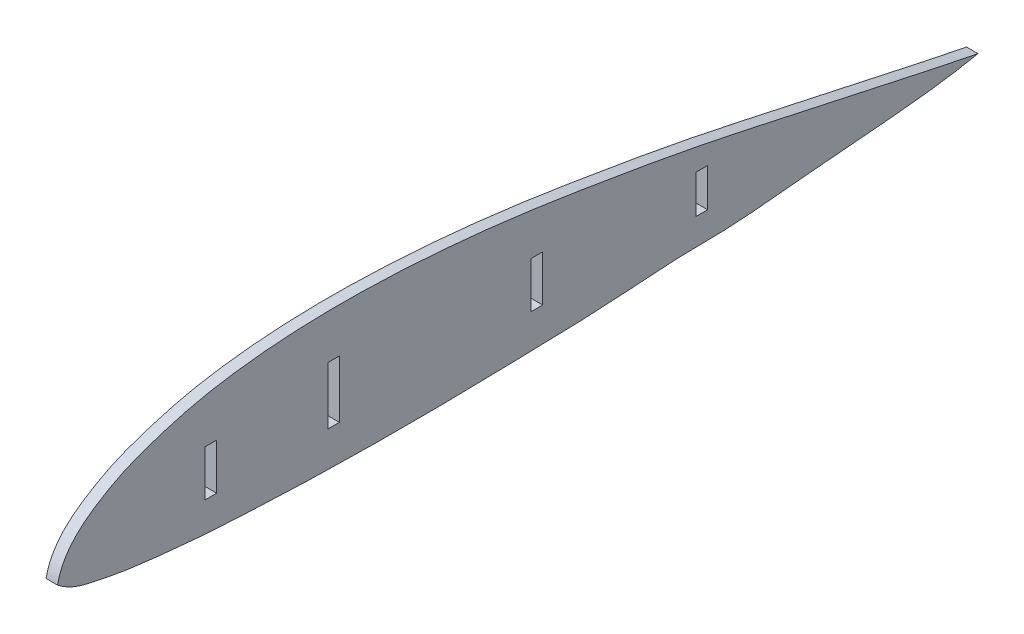
ISO-10303-21;
HEADER;
FILE_DESCRIPTION(('STEP AP214'),'2;1');
FILE_NAME('part.step','',(''),(''),'','','');
FILE_SCHEMA(('AUTOMOTIVE_DESIGN { 1 0 10303 214 1 1 1 1 }'));
ENDSEC;
DATA;
#1=APPLICATION_CONTEXT('core data for automotive mechanical design processes');
#2=APPLICATION_PROTOCOL_DEFINITION('international standard','automotive_design',2000,#1);
#3=PRODUCT_CONTEXT('',#1,'mechanical');
#4=PRODUCT('Part','Part','',(#3));
#5=PRODUCT_RELATED_PRODUCT_CATEGORY('part','',(#4));
#6=PRODUCT_DEFINITION_FORMATION('','',#4);
#7=PRODUCT_DEFINITION_CONTEXT('part definition',#1,'design');
#8=PRODUCT_DEFINITION('design','',#6,#7);
#9=PRODUCT_DEFINITION_SHAPE('','',#8);
#10=(LENGTH_UNIT() NAMED_UNIT(*) SI_UNIT(.MILLI.,.METRE.));
#11=(NAMED_UNIT(*) PLANE_ANGLE_UNIT() SI_UNIT($,.RADIAN.));
#12=(NAMED_UNIT(*) SI_UNIT($,.STERADIAN.) SOLID_ANGLE_UNIT());
#13=UNCERTAINTY_MEASURE_WITH_UNIT(LENGTH_MEASURE(1.E-05),#10,'distance_accuracy_value','');
#14=(GEOMETRIC_REPRESENTATION_CONTEXT(3) GLOBAL_UNCERTAINTY_ASSIGNED_CONTEXT((#13)) GLOBAL_UNIT_ASSIGNED_CONTEXT((#10,
#11,#12)) REPRESENTATION_CONTEXT('',''));
#15=CARTESIAN_POINT('',(0.,0.,0.));
#16=DIRECTION('',(0.,0.,1.));
#17=DIRECTION('',(1.,0.,0.));
#18=AXIS2_PLACEMENT_3D('',#15,#16,#17);
#19=CARTESIAN_POINT('',(3.,0.,240.));
#20=CARTESIAN_POINT('',(3.,-2.88663712280927,236.523911789921));
#21=CARTESIAN_POINT('',(3.,-4.06778606087941,230.220810861395));
#22=CARTESIAN_POINT('',(3.,-5.64877990651582,222.028601874124));
#23=CARTESIAN_POINT('',(3.,-6.60851401532716,214.009642515101));
#24=CARTESIAN_POINT('',(3.,-7.65058139006474,204.019456847261));
#25=CARTESIAN_POINT('',(3.,-8.62100436946901,188.0105436438));
#26=CARTESIAN_POINT('',(3.,-9.35502805275515,168.008371033474));
#27=CARTESIAN_POINT('',(3.,-9.54465584837777,143.997445941081));
#28=CARTESIAN_POINT('',(3.,-9.00057164569615,119.996434597562));
#29=CARTESIAN_POINT('',(3.,-8.45231331914167,95.9841207137069));
#30=CARTESIAN_POINT('',(3.,-6.86154925632092,79.4444514819222));
#31=CARTESIAN_POINT('',(3.,-6.94135781790873,63.4128510279465));
#32=CARTESIAN_POINT('',(3.,-5.14929657813988,47.4214800178839));
#33=CARTESIAN_POINT('',(3.,-3.34616289016771,23.9519910613881));
#34=CARTESIAN_POINT('',(3.,-1.67223814751534,7.91601145609598));
#35=CARTESIAN_POINT('',(3.,0.,0.));
#36=B_SPLINE_CURVE_WITH_KNOTS('',3,(#19,#20,#21,#22,#23,#24,#25,#26,#27,#28,#29,#30,#31,#32,#33,
#34,#35),.UNSPECIFIED.,.F.,.F.,(4,1,1,1,1,1,1,1,1,1,1,1,1,1,4),(0.,0.0534752742490124,
0.078709310431568,0.103753203869046,0.153672751320013,0.203448048800785,0.302856430572072,
0.402198969890009,0.501554024856561,0.600954522211836,0.700430480598882,0.70748041607058,
0.79999645484155,0.899715684831644,1.),.UNSPECIFIED.);
#37=DIRECTION('',(-1.,0.,0.));
#38=VECTOR('',#37,1.);
#39=SURFACE_OF_LINEAR_EXTRUSION('',#36,#38);
#40=CARTESIAN_POINT('',(0.,0.,240.));
#41=CARTESIAN_POINT('',(0.,-2.88663712280927,236.523911789921));
#42=CARTESIAN_POINT('',(0.,-4.06778606087941,230.220810861395));
#43=CARTESIAN_POINT('',(0.,-5.64877990651582,222.028601874124));
#44=CARTESIAN_POINT('',(0.,-6.60851401532716,214.009642515101));
#45=CARTESIAN_POINT('',(0.,-7.65058139006474,204.019456847261));
#46=CARTESIAN_POINT('',(0.,-8.62100436946901,188.0105436438));
#47=CARTESIAN_POINT('',(0.,-9.35502805275515,168.008371033474));
#48=CARTESIAN_POINT('',(0.,-9.54465584837777,143.997445941081));
#49=CARTESIAN_POINT('',(0.,-9.00057164569615,119.996434597562));
#50=CARTESIAN_POINT('',(0.,-8.45231331914167,95.9841207137069));
#51=CARTESIAN_POINT('',(0.,-6.86154925632092,79.4444514819222));
#52=CARTESIAN_POINT('',(0.,-6.94135781790873,63.4128510279465));
#53=CARTESIAN_POINT('',(0.,-5.14929657813988,47.4214800178839));
#54=CARTESIAN_POINT('',(0.,-3.34616289016771,23.9519910613881));
#55=CARTESIAN_POINT('',(0.,-1.67223814751534,7.91601145609598));
#56=CARTESIAN_POINT('',(0.,0.,0.));
#57=B_SPLINE_CURVE_WITH_KNOTS('',3,(#40,#41,#42,#43,#44,#45,#46,#47,#48,#49,#50,#51,#52,#53,#54,
#55,#56),.UNSPECIFIED.,.F.,.F.,(4,1,1,1,1,1,1,1,1,1,1,1,1,1,4),(0.,0.0534752742490124,
0.078709310431568,0.103753203869046,0.153672751320013,0.203448048800785,0.302856430572072,
0.402198969890009,0.501554024856561,0.600954522211836,0.700430480598882,0.70748041607058,
0.79999645484155,0.899715684831644,1.),.UNSPECIFIED.);
#58=CARTESIAN_POINT('',(0.,0.,240.));
#59=VERTEX_POINT('',#58);
#60=CARTESIAN_POINT('',(0.,0.,0.));
#61=VERTEX_POINT('',#60);
#62=EDGE_CURVE('E290',#59,#61,#57,.T.);
#63=ORIENTED_EDGE('',*,*,#62,.T.);
#64=DIRECTION('',(-1.,0.,0.));
#65=VECTOR('',#64,1.);
#66=CARTESIAN_POINT('',(3.,0.,0.));
#67=LINE('',#66,#65);
#68=CARTESIAN_POINT('',(3.,0.,0.));
#69=VERTEX_POINT('',#68);
#70=EDGE_CURVE('E11',#69,#61,#67,.T.);
#71=ORIENTED_EDGE('',*,*,#70,.F.);
#72=CARTESIAN_POINT('',(3.,0.,240.));
#73=VERTEX_POINT('',#72);
#74=EDGE_CURVE('E296',#73,#69,#36,.T.);
#75=ORIENTED_EDGE('',*,*,#74,.F.);
#76=DIRECTION('',(-1.,0.,0.));
#77=VECTOR('',#76,1.);
#78=CARTESIAN_POINT('',(3.,0.,240.));
#79=LINE('',#78,#77);
#80=EDGE_CURVE('E48',#73,#59,#79,.T.);
#81=ORIENTED_EDGE('',*,*,#80,.T.);
#82=EDGE_LOOP('',(#63,#71,#75,#81));
#83=FACE_BOUND('',#82,.T.);
#84=ADVANCED_FACE('F40',(#83),#39,.F.);
#85=CARTESIAN_POINT('',(3.,0.,0.));
#86=CARTESIAN_POINT('',(3.,1.52360068225762,8.03746926130975));
#87=CARTESIAN_POINT('',(3.,5.17138323074117,23.9897917168263));
#88=CARTESIAN_POINT('',(3.,10.2205786034995,48.0059783922376));
#89=CARTESIAN_POINT('',(3.,15.5619770262737,71.9126579513757));
#90=CARTESIAN_POINT('',(3.,19.7588120032883,95.9537600079154));
#91=CARTESIAN_POINT('',(3.,23.5677508672796,119.918298993928));
#92=CARTESIAN_POINT('',(3.,26.0263882263808,143.945589986485));
#93=CARTESIAN_POINT('',(3.,26.9601439821251,168.007150596988));
#94=CARTESIAN_POINT('',(3.,25.8933216802265,188.104616678397));
#95=CARTESIAN_POINT('',(3.,23.2639042392419,204.156129060536));
#96=CARTESIAN_POINT('',(3.,20.3434828261758,214.111867769092));
#97=CARTESIAN_POINT('',(3.,17.4120912155664,222.175332594537));
#98=CARTESIAN_POINT('',(3.,12.3378274401084,231.611968899749));
#99=CARTESIAN_POINT('',(3.,6.88597595591278,238.539586147514));
#100=CARTESIAN_POINT('',(3.,0.,240.));
#101=B_SPLINE_CURVE_WITH_KNOTS('',3,(#85,#86,#87,#88,#89,#90,#91,#92,#93,#94,#95,#96,#97,#98,
#99,#100),.UNSPECIFIED.,.F.,.F.,(4,1,1,1,1,1,1,1,1,1,1,1,1,4),(0.,0.0976537739938577,
0.195364998835535,0.293026196954694,0.390079704897671,0.486695277187024,0.582699676897636,
0.678273314662547,0.77397516907434,0.822435696462195,0.872109787552887,0.897672395288057,
0.924653988799848,1.),.UNSPECIFIED.);
#102=DIRECTION('',(-1.,0.,0.));
#103=VECTOR('',#102,1.);
#104=SURFACE_OF_LINEAR_EXTRUSION('',#101,#103);
#105=CARTESIAN_POINT('',(0.,0.,0.));
#106=CARTESIAN_POINT('',(0.,1.52360068225762,8.03746926130975));
#107=CARTESIAN_POINT('',(0.,5.17138323074117,23.9897917168263));
#108=CARTESIAN_POINT('',(0.,10.2205786034995,48.0059783922376));
#109=CARTESIAN_POINT('',(0.,15.5619770262737,71.9126579513757));
#110=CARTESIAN_POINT('',(0.,19.7588120032883,95.9537600079154));
#111=CARTESIAN_POINT('',(0.,23.5677508672796,119.918298993928));
#112=CARTESIAN_POINT('',(0.,26.0263882263808,143.945589986485));
#113=CARTESIAN_POINT('',(0.,26.9601439821251,168.007150596988));
#114=CARTESIAN_POINT('',(0.,25.8933216802265,188.104616678397));
#115=CARTESIAN_POINT('',(0.,23.2639042392419,204.156129060536));
#116=CARTESIAN_POINT('',(0.,20.3434828261758,214.111867769092));
#117=CARTESIAN_POINT('',(0.,17.4120912155664,222.175332594537));
#118=CARTESIAN_POINT('',(0.,12.3378274401084,231.611968899749));
#119=CARTESIAN_POINT('',(0.,6.88597595591278,238.539586147514));
#120=CARTESIAN_POINT('',(0.,0.,240.));
#121=B_SPLINE_CURVE_WITH_KNOTS('',3,(#105,#106,#107,#108,#109,#110,#111,#112,#113,#114,#115,
#116,#117,#118,#119,#120),.UNSPECIFIED.,.F.,.F.,(4,1,1,1,1,1,1,1,1,1,1,1,1,4),(0.,
0.0976537739938577,0.195364998835535,0.293026196954694,0.390079704897671,0.486695277187024,
0.582699676897636,0.678273314662547,0.77397516907434,0.822435696462195,0.872109787552887,
0.897672395288057,0.924653988799848,1.),.UNSPECIFIED.);
#122=EDGE_CURVE('E303',#61,#59,#121,.T.);
#123=ORIENTED_EDGE('',*,*,#122,.T.);
#124=ORIENTED_EDGE('',*,*,#80,.F.);
#125=EDGE_CURVE('E302',#69,#73,#101,.T.);
#126=ORIENTED_EDGE('',*,*,#125,.F.);
#127=ORIENTED_EDGE('',*,*,#70,.T.);
#128=EDGE_LOOP('',(#123,#124,#126,#127));
#129=FACE_BOUND('',#128,.T.);
#130=ADVANCED_FACE('F317',(#129),#104,.F.);
#131=CARTESIAN_POINT('',(3.,-9.00853891874286,120.375365675922));
#132=DIRECTION('',(-1.,0.,0.));
#133=DIRECTION('',(0.,0.,1.));
#134=AXIS2_PLACEMENT_3D('',#131,#132,#133);
#135=PLANE('',#134);
#136=DIRECTION('',(0.,1.,0.));
#137=VECTOR('',#136,1.);
#138=CARTESIAN_POINT('',(3.,10.,73.5));
#139=LINE('',#138,#137);
#140=CARTESIAN_POINT('',(3.,0.,73.5));
#141=VERTEX_POINT('',#140);
#142=CARTESIAN_POINT('',(3.,10.,73.5));
#143=VERTEX_POINT('',#142);
#144=EDGE_CURVE('E241',#141,#143,#139,.T.);
#145=ORIENTED_EDGE('',*,*,#144,.T.);
#146=DIRECTION('',(0.,0.,-1.));
#147=VECTOR('',#146,1.);
#148=CARTESIAN_POINT('',(3.,10.,70.5));
#149=LINE('',#148,#147);
#150=CARTESIAN_POINT('',(3.,10.,70.5));
#151=VERTEX_POINT('',#150);
#152=EDGE_CURVE('E252',#143,#151,#149,.T.);
#153=ORIENTED_EDGE('',*,*,#152,.T.);
#154=DIRECTION('',(0.,-1.,0.));
#155=VECTOR('',#154,1.);
#156=CARTESIAN_POINT('',(3.,0.,70.5));
#157=LINE('',#156,#155);
#158=CARTESIAN_POINT('',(3.,0.,70.5));
#159=VERTEX_POINT('',#158);
#160=EDGE_CURVE('E262',#151,#159,#157,.T.);
#161=ORIENTED_EDGE('',*,*,#160,.T.);
#162=DIRECTION('',(0.,0.,1.));
#163=VECTOR('',#162,1.);
#164=CARTESIAN_POINT('',(3.,0.,70.5));
#165=LINE('',#164,#163);
#166=EDGE_CURVE('E55',#159,#141,#165,.T.);
#167=ORIENTED_EDGE('',*,*,#166,.T.);
#168=EDGE_LOOP('',(#145,#153,#161,#167));
#169=FACE_BOUND('',#168,.T.);
#170=DIRECTION('',(0.,0.,1.));
#171=VECTOR('',#170,1.);
#172=CARTESIAN_POINT('',(3.,0.,201.5));
#173=LINE('',#172,#171);
#174=CARTESIAN_POINT('',(3.,0.,198.5));
#175=VERTEX_POINT('',#174);
#176=CARTESIAN_POINT('',(3.,0.,201.5));
#177=VERTEX_POINT('',#176);
#178=EDGE_CURVE('E211',#175,#177,#173,.T.);
#179=ORIENTED_EDGE('',*,*,#178,.T.);
#180=DIRECTION('',(0.,1.,0.));
#181=VECTOR('',#180,1.);
#182=CARTESIAN_POINT('',(3.,12.,201.5));
#183=LINE('',#182,#181);
#184=CARTESIAN_POINT('',(3.,12.,201.5));
#185=VERTEX_POINT('',#184);
#186=EDGE_CURVE('E223',#177,#185,#183,.T.);
#187=ORIENTED_EDGE('',*,*,#186,.T.);
#188=DIRECTION('',(0.,0.,-1.));
#189=VECTOR('',#188,1.);
#190=CARTESIAN_POINT('',(3.,12.,198.5));
#191=LINE('',#190,#189);
#192=CARTESIAN_POINT('',(3.,12.,198.5));
#193=VERTEX_POINT('',#192);
#194=EDGE_CURVE('E233',#185,#193,#191,.T.);
#195=ORIENTED_EDGE('',*,*,#194,.T.);
#196=DIRECTION('',(0.,-1.,0.));
#197=VECTOR('',#196,1.);
#198=CARTESIAN_POINT('',(3.,0.,198.5));
#199=LINE('',#198,#197);
#200=EDGE_CURVE('E63',#193,#175,#199,.T.);
#201=ORIENTED_EDGE('',*,*,#200,.T.);
#202=EDGE_LOOP('',(#179,#187,#195,#201));
#203=FACE_BOUND('',#202,.T.);
#204=DIRECTION('',(0.,-1.,0.));
#205=VECTOR('',#204,1.);
#206=CARTESIAN_POINT('',(3.,15.,166.5));
#207=LINE('',#206,#205);
#208=CARTESIAN_POINT('',(3.,15.,166.5));
#209=VERTEX_POINT('',#208);
#210=CARTESIAN_POINT('',(3.,0.,166.5));
#211=VERTEX_POINT('',#210);
#212=EDGE_CURVE('E198',#209,#211,#207,.T.);
#213=ORIENTED_EDGE('',*,*,#212,.T.);
#214=DIRECTION('',(0.,0.,1.));
#215=VECTOR('',#214,1.);
#216=CARTESIAN_POINT('',(3.,0.,166.5));
#217=LINE('',#216,#215);
#218=CARTESIAN_POINT('',(3.,0.,169.5));
#219=VERTEX_POINT('',#218);
#220=EDGE_CURVE('E171',#211,#219,#217,.T.);
#221=ORIENTED_EDGE('',*,*,#220,.T.);
#222=DIRECTION('',(0.,1.,0.));
#223=VECTOR('',#222,1.);
#224=CARTESIAN_POINT('',(3.,0.,169.5));
#225=LINE('',#224,#223);
#226=CARTESIAN_POINT('',(3.,15.,169.5));
#227=VERTEX_POINT('',#226);
#228=EDGE_CURVE('E204',#219,#227,#225,.T.);
#229=ORIENTED_EDGE('',*,*,#228,.T.);
#230=DIRECTION('',(0.,0.,-1.));
#231=VECTOR('',#230,1.);
#232=CARTESIAN_POINT('',(3.,15.,169.5));
#233=LINE('',#232,#231);
#234=EDGE_CURVE('E200',#227,#209,#233,.T.);
#235=ORIENTED_EDGE('',*,*,#234,.T.);
#236=EDGE_LOOP('',(#213,#221,#229,#235));
#237=FACE_BOUND('',#236,.T.);
#238=DIRECTION('',(0.,1.,0.));
#239=VECTOR('',#238,1.);
#240=CARTESIAN_POINT('',(3.,0.,116.5));
#241=LINE('',#240,#239);
#242=CARTESIAN_POINT('',(3.,0.,116.5));
#243=VERTEX_POINT('',#242);
#244=CARTESIAN_POINT('',(3.,12.,116.5));
#245=VERTEX_POINT('',#244);
#246=EDGE_CURVE('E277',#243,#245,#241,.T.);
#247=ORIENTED_EDGE('',*,*,#246,.T.);
#248=DIRECTION('',(0.,0.,-1.));
#249=VECTOR('',#248,1.);
#250=CARTESIAN_POINT('',(3.,12.,116.5));
#251=LINE('',#250,#249);
#252=CARTESIAN_POINT('',(3.,12.,113.5));
#253=VERTEX_POINT('',#252);
#254=EDGE_CURVE('E267',#245,#253,#251,.T.);
#255=ORIENTED_EDGE('',*,*,#254,.T.);
#256=DIRECTION('',(0.,-1.,0.));
#257=VECTOR('',#256,1.);
#258=CARTESIAN_POINT('',(3.,12.,113.5));
#259=LINE('',#258,#257);
#260=CARTESIAN_POINT('',(3.,0.,113.5));
#261=VERTEX_POINT('',#260);
#262=EDGE_CURVE('E270',#253,#261,#259,.T.);
#263=ORIENTED_EDGE('',*,*,#262,.T.);
#264=DIRECTION('',(0.,0.,1.));
#265=VECTOR('',#264,1.);
#266=CARTESIAN_POINT('',(3.,0.,116.5));
#267=LINE('',#266,#265);
#268=EDGE_CURVE('E274',#261,#243,#267,.T.);
#269=ORIENTED_EDGE('',*,*,#268,.T.);
#270=EDGE_LOOP('',(#247,#255,#263,#269));
#271=FACE_BOUND('',#270,.T.);
#272=ORIENTED_EDGE('',*,*,#74,.T.);
#273=ORIENTED_EDGE('',*,*,#125,.T.);
#274=EDGE_LOOP('',(#272,#273));
#275=FACE_BOUND('',#274,.T.);
#276=ADVANCED_FACE('F320',(#169,#203,#237,#271,#275),#135,.F.);
#277=CARTESIAN_POINT('',(0.,-9.00853891874286,120.375365675922));
#278=DIRECTION('',(-1.,0.,0.));
#279=DIRECTION('',(0.,0.,1.));
#280=AXIS2_PLACEMENT_3D('',#277,#278,#279);
#281=PLANE('',#280);
#282=DIRECTION('',(0.,0.,-1.));
#283=VECTOR('',#282,1.);
#284=CARTESIAN_POINT('',(0.,10.,70.5));
#285=LINE('',#284,#283);
#286=CARTESIAN_POINT('',(0.,10.,73.5));
#287=VERTEX_POINT('',#286);
#288=CARTESIAN_POINT('',(0.,10.,70.5));
#289=VERTEX_POINT('',#288);
#290=EDGE_CURVE('E218',#287,#289,#285,.T.);
#291=ORIENTED_EDGE('',*,*,#290,.F.);
#292=DIRECTION('',(0.,1.,0.));
#293=VECTOR('',#292,1.);
#294=CARTESIAN_POINT('',(0.,10.,73.5));
#295=LINE('',#294,#293);
#296=CARTESIAN_POINT('',(0.,0.,73.5));
#297=VERTEX_POINT('',#296);
#298=EDGE_CURVE('E248',#297,#287,#295,.T.);
#299=ORIENTED_EDGE('',*,*,#298,.F.);
#300=DIRECTION('',(0.,0.,1.));
#301=VECTOR('',#300,1.);
#302=CARTESIAN_POINT('',(0.,0.,70.5));
#303=LINE('',#302,#301);
#304=CARTESIAN_POINT('',(0.,0.,70.5));
#305=VERTEX_POINT('',#304);
#306=EDGE_CURVE('E251',#305,#297,#303,.T.);
#307=ORIENTED_EDGE('',*,*,#306,.F.);
#308=DIRECTION('',(0.,-1.,0.));
#309=VECTOR('',#308,1.);
#310=CARTESIAN_POINT('',(0.,0.,70.5));
#311=LINE('',#310,#309);
#312=EDGE_CURVE('E255',#289,#305,#311,.T.);
#313=ORIENTED_EDGE('',*,*,#312,.F.);
#314=EDGE_LOOP('',(#291,#299,#307,#313));
#315=FACE_BOUND('',#314,.T.);
#316=DIRECTION('',(0.,1.,0.));
#317=VECTOR('',#316,1.);
#318=CARTESIAN_POINT('',(0.,12.,201.5));
#319=LINE('',#318,#317);
#320=CARTESIAN_POINT('',(0.,0.,201.5));
#321=VERTEX_POINT('',#320);
#322=CARTESIAN_POINT('',(0.,12.,201.5));
#323=VERTEX_POINT('',#322);
#324=EDGE_CURVE('E176',#321,#323,#319,.T.);
#325=ORIENTED_EDGE('',*,*,#324,.F.);
#326=DIRECTION('',(0.,0.,1.));
#327=VECTOR('',#326,1.);
#328=CARTESIAN_POINT('',(0.,0.,201.5));
#329=LINE('',#328,#327);
#330=CARTESIAN_POINT('',(0.,0.,198.5));
#331=VERTEX_POINT('',#330);
#332=EDGE_CURVE('E219',#331,#321,#329,.T.);
#333=ORIENTED_EDGE('',*,*,#332,.F.);
#334=DIRECTION('',(0.,-1.,0.));
#335=VECTOR('',#334,1.);
#336=CARTESIAN_POINT('',(0.,0.,198.5));
#337=LINE('',#336,#335);
#338=CARTESIAN_POINT('',(0.,12.,198.5));
#339=VERTEX_POINT('',#338);
#340=EDGE_CURVE('E222',#339,#331,#337,.T.);
#341=ORIENTED_EDGE('',*,*,#340,.F.);
#342=DIRECTION('',(0.,0.,-1.));
#343=VECTOR('',#342,1.);
#344=CARTESIAN_POINT('',(0.,12.,198.5));
#345=LINE('',#344,#343);
#346=EDGE_CURVE('E226',#323,#339,#345,.T.);
#347=ORIENTED_EDGE('',*,*,#346,.F.);
#348=EDGE_LOOP('',(#325,#333,#341,#347));
#349=FACE_BOUND('',#348,.T.);
#350=DIRECTION('',(0.,0.,1.));
#351=VECTOR('',#350,1.);
#352=CARTESIAN_POINT('',(0.,0.,166.5));
#353=LINE('',#352,#351);
#354=CARTESIAN_POINT('',(0.,0.,166.5));
#355=VERTEX_POINT('',#354);
#356=CARTESIAN_POINT('',(0.,0.,169.5));
#357=VERTEX_POINT('',#356);
#358=EDGE_CURVE('E168',#355,#357,#353,.T.);
#359=ORIENTED_EDGE('',*,*,#358,.F.);
#360=DIRECTION('',(0.,-1.,0.));
#361=VECTOR('',#360,1.);
#362=CARTESIAN_POINT('',(0.,15.,166.5));
#363=LINE('',#362,#361);
#364=CARTESIAN_POINT('',(0.,15.,166.5));
#365=VERTEX_POINT('',#364);
#366=EDGE_CURVE('E179',#365,#355,#363,.T.);
#367=ORIENTED_EDGE('',*,*,#366,.F.);
#368=DIRECTION('',(0.,0.,-1.));
#369=VECTOR('',#368,1.);
#370=CARTESIAN_POINT('',(0.,15.,169.5));
#371=LINE('',#370,#369);
#372=CARTESIAN_POINT('',(0.,15.,169.5));
#373=VERTEX_POINT('',#372);
#374=EDGE_CURVE('E184',#373,#365,#371,.T.);
#375=ORIENTED_EDGE('',*,*,#374,.F.);
#376=DIRECTION('',(0.,1.,0.));
#377=VECTOR('',#376,1.);
#378=CARTESIAN_POINT('',(0.,0.,169.5));
#379=LINE('',#378,#377);
#380=EDGE_CURVE('E190',#357,#373,#379,.T.);
#381=ORIENTED_EDGE('',*,*,#380,.F.);
#382=EDGE_LOOP('',(#359,#367,#375,#381));
#383=FACE_BOUND('',#382,.T.);
#384=DIRECTION('',(0.,0.,-1.));
#385=VECTOR('',#384,1.);
#386=CARTESIAN_POINT('',(0.,12.,116.5));
#387=LINE('',#386,#385);
#388=CARTESIAN_POINT('',(0.,12.,116.5));
#389=VERTEX_POINT('',#388);
#390=CARTESIAN_POINT('',(0.,12.,113.5));
#391=VERTEX_POINT('',#390);
#392=EDGE_CURVE('E191',#389,#391,#387,.T.);
#393=ORIENTED_EDGE('',*,*,#392,.F.);
#394=DIRECTION('',(0.,1.,0.));
#395=VECTOR('',#394,1.);
#396=CARTESIAN_POINT('',(0.,0.,116.5));
#397=LINE('',#396,#395);
#398=CARTESIAN_POINT('',(0.,0.,116.5));
#399=VERTEX_POINT('',#398);
#400=EDGE_CURVE('E271',#399,#389,#397,.T.);
#401=ORIENTED_EDGE('',*,*,#400,.F.);
#402=DIRECTION('',(0.,0.,1.));
#403=VECTOR('',#402,1.);
#404=CARTESIAN_POINT('',(0.,0.,116.5));
#405=LINE('',#404,#403);
#406=CARTESIAN_POINT('',(0.,0.,113.5));
#407=VERTEX_POINT('',#406);
#408=EDGE_CURVE('E283',#407,#399,#405,.T.);
#409=ORIENTED_EDGE('',*,*,#408,.F.);
#410=DIRECTION('',(0.,-1.,0.));
#411=VECTOR('',#410,1.);
#412=CARTESIAN_POINT('',(0.,12.,113.5));
#413=LINE('',#412,#411);
#414=EDGE_CURVE('E193',#391,#407,#413,.T.);
#415=ORIENTED_EDGE('',*,*,#414,.F.);
#416=EDGE_LOOP('',(#393,#401,#409,#415));
#417=FACE_BOUND('',#416,.T.);
#418=ORIENTED_EDGE('',*,*,#62,.F.);
#419=ORIENTED_EDGE('',*,*,#122,.F.);
#420=EDGE_LOOP('',(#418,#419));
#421=FACE_BOUND('',#420,.T.);
#422=ADVANCED_FACE('F187',(#315,#349,#383,#417,#421),#281,.T.);
#423=CARTESIAN_POINT('',(3.,12.,116.5));
#424=DIRECTION('',(0.,1.,0.));
#425=DIRECTION('',(0.,0.,1.));
#426=AXIS2_PLACEMENT_3D('',#423,#424,#425);
#427=PLANE('',#426);
#428=ORIENTED_EDGE('',*,*,#392,.T.);
#429=DIRECTION('',(-1.,0.,0.));
#430=VECTOR('',#429,1.);
#431=CARTESIAN_POINT('',(3.,12.,113.5));
#432=LINE('',#431,#430);
#433=EDGE_CURVE('E279',#253,#391,#432,.T.);
#434=ORIENTED_EDGE('',*,*,#433,.F.);
#435=ORIENTED_EDGE('',*,*,#254,.F.);
#436=DIRECTION('',(-1.,0.,0.));
#437=VECTOR('',#436,1.);
#438=CARTESIAN_POINT('',(3.,12.,116.5));
#439=LINE('',#438,#437);
#440=EDGE_CURVE('E288',#245,#389,#439,.T.);
#441=ORIENTED_EDGE('',*,*,#440,.T.);
#442=EDGE_LOOP('',(#428,#434,#435,#441));
#443=FACE_BOUND('',#442,.T.);
#444=ADVANCED_FACE('F324',(#443),#427,.F.);
#445=CARTESIAN_POINT('',(3.,0.,116.5));
#446=DIRECTION('',(0.,0.,1.));
#447=DIRECTION('',(1.,0.,0.));
#448=AXIS2_PLACEMENT_3D('',#445,#446,#447);
#449=PLANE('',#448);
#450=ORIENTED_EDGE('',*,*,#400,.T.);
#451=ORIENTED_EDGE('',*,*,#440,.F.);
#452=ORIENTED_EDGE('',*,*,#246,.F.);
#453=DIRECTION('',(-1.,0.,0.));
#454=VECTOR('',#453,1.);
#455=CARTESIAN_POINT('',(3.,0.,116.5));
#456=LINE('',#455,#454);
#457=EDGE_CURVE('E291',#243,#399,#456,.T.);
#458=ORIENTED_EDGE('',*,*,#457,.T.);
#459=EDGE_LOOP('',(#450,#451,#452,#458));
#460=FACE_BOUND('',#459,.T.);
#461=ADVANCED_FACE('F331',(#460),#449,.F.);
#462=CARTESIAN_POINT('',(3.,0.,116.5));
#463=DIRECTION('',(0.,-1.,0.));
#464=DIRECTION('',(0.,0.,-1.));
#465=AXIS2_PLACEMENT_3D('',#462,#463,#464);
#466=PLANE('',#465);
#467=ORIENTED_EDGE('',*,*,#408,.T.);
#468=ORIENTED_EDGE('',*,*,#457,.F.);
#469=ORIENTED_EDGE('',*,*,#268,.F.);
#470=DIRECTION('',(-1.,0.,0.));
#471=VECTOR('',#470,1.);
#472=CARTESIAN_POINT('',(3.,0.,113.5));
#473=LINE('',#472,#471);
#474=EDGE_CURVE('E293',#261,#407,#473,.T.);
#475=ORIENTED_EDGE('',*,*,#474,.T.);
#476=EDGE_LOOP('',(#467,#468,#469,#475));
#477=FACE_BOUND('',#476,.T.);
#478=ADVANCED_FACE('F336',(#477),#466,.F.);
#479=CARTESIAN_POINT('',(3.,12.,113.5));
#480=DIRECTION('',(0.,0.,-1.));
#481=DIRECTION('',(-1.,0.,0.));
#482=AXIS2_PLACEMENT_3D('',#479,#480,#481);
#483=PLANE('',#482);
#484=ORIENTED_EDGE('',*,*,#414,.T.);
#485=ORIENTED_EDGE('',*,*,#474,.F.);
#486=ORIENTED_EDGE('',*,*,#262,.F.);
#487=ORIENTED_EDGE('',*,*,#433,.T.);
#488=EDGE_LOOP('',(#484,#485,#486,#487));
#489=FACE_BOUND('',#488,.T.);
#490=ADVANCED_FACE('F333',(#489),#483,.F.);
#491=CARTESIAN_POINT('',(3.,0.,166.5));
#492=DIRECTION('',(0.,-1.,0.));
#493=DIRECTION('',(0.,0.,-1.));
#494=AXIS2_PLACEMENT_3D('',#491,#492,#493);
#495=PLANE('',#494);
#496=ORIENTED_EDGE('',*,*,#358,.T.);
#497=DIRECTION('',(-1.,0.,0.));
#498=VECTOR('',#497,1.);
#499=CARTESIAN_POINT('',(3.,0.,169.5));
#500=LINE('',#499,#498);
#501=EDGE_CURVE('E201',#219,#357,#500,.T.);
#502=ORIENTED_EDGE('',*,*,#501,.F.);
#503=ORIENTED_EDGE('',*,*,#220,.F.);
#504=DIRECTION('',(-1.,0.,0.));
#505=VECTOR('',#504,1.);
#506=CARTESIAN_POINT('',(3.,0.,166.5));
#507=LINE('',#506,#505);
#508=EDGE_CURVE('E164',#211,#355,#507,.T.);
#509=ORIENTED_EDGE('',*,*,#508,.T.);
#510=EDGE_LOOP('',(#496,#502,#503,#509));
#511=FACE_BOUND('',#510,.T.);
#512=ADVANCED_FACE('F166',(#511),#495,.F.);
#513=CARTESIAN_POINT('',(3.,15.,166.5));
#514=DIRECTION('',(0.,0.,-1.));
#515=DIRECTION('',(-1.,0.,0.));
#516=AXIS2_PLACEMENT_3D('',#513,#514,#515);
#517=PLANE('',#516);
#518=ORIENTED_EDGE('',*,*,#366,.T.);
#519=ORIENTED_EDGE('',*,*,#508,.F.);
#520=ORIENTED_EDGE('',*,*,#212,.F.);
#521=DIRECTION('',(-1.,0.,0.));
#522=VECTOR('',#521,1.);
#523=CARTESIAN_POINT('',(3.,15.,166.5));
#524=LINE('',#523,#522);
#525=EDGE_CURVE('E175',#209,#365,#524,.T.);
#526=ORIENTED_EDGE('',*,*,#525,.T.);
#527=EDGE_LOOP('',(#518,#519,#520,#526));
#528=FACE_BOUND('',#527,.T.);
#529=ADVANCED_FACE('F180',(#528),#517,.F.);
#530=CARTESIAN_POINT('',(3.,15.,169.5));
#531=DIRECTION('',(0.,1.,0.));
#532=DIRECTION('',(0.,0.,1.));
#533=AXIS2_PLACEMENT_3D('',#530,#531,#532);
#534=PLANE('',#533);
#535=ORIENTED_EDGE('',*,*,#374,.T.);
#536=ORIENTED_EDGE('',*,*,#525,.F.);
#537=ORIENTED_EDGE('',*,*,#234,.F.);
#538=DIRECTION('',(-1.,0.,0.));
#539=VECTOR('',#538,1.);
#540=CARTESIAN_POINT('',(3.,15.,169.5));
#541=LINE('',#540,#539);
#542=EDGE_CURVE('E562',#227,#373,#541,.T.);
#543=ORIENTED_EDGE('',*,*,#542,.T.);
#544=EDGE_LOOP('',(#535,#536,#537,#543));
#545=FACE_BOUND('',#544,.T.);
#546=ADVANCED_FACE('F377',(#545),#534,.F.);
#547=CARTESIAN_POINT('',(3.,0.,169.5));
#548=DIRECTION('',(0.,0.,1.));
#549=DIRECTION('',(1.,0.,0.));
#550=AXIS2_PLACEMENT_3D('',#547,#548,#549);
#551=PLANE('',#550);
#552=ORIENTED_EDGE('',*,*,#380,.T.);
#553=ORIENTED_EDGE('',*,*,#542,.F.);
#554=ORIENTED_EDGE('',*,*,#228,.F.);
#555=ORIENTED_EDGE('',*,*,#501,.T.);
#556=EDGE_LOOP('',(#552,#553,#554,#555));
#557=FACE_BOUND('',#556,.T.);
#558=ADVANCED_FACE('F373',(#557),#551,.F.);
#559=CARTESIAN_POINT('',(3.,12.,201.5));
#560=DIRECTION('',(0.,0.,1.));
#561=DIRECTION('',(1.,0.,0.));
#562=AXIS2_PLACEMENT_3D('',#559,#560,#561);
#563=PLANE('',#562);
#564=ORIENTED_EDGE('',*,*,#324,.T.);
#565=DIRECTION('',(-1.,0.,0.));
#566=VECTOR('',#565,1.);
#567=CARTESIAN_POINT('',(3.,12.,201.5));
#568=LINE('',#567,#566);
#569=EDGE_CURVE('E208',#185,#323,#568,.T.);
#570=ORIENTED_EDGE('',*,*,#569,.F.);
#571=ORIENTED_EDGE('',*,*,#186,.F.);
#572=DIRECTION('',(-1.,0.,0.));
#573=VECTOR('',#572,1.);
#574=CARTESIAN_POINT('',(3.,0.,201.5));
#575=LINE('',#574,#573);
#576=EDGE_CURVE('E216',#177,#321,#575,.T.);
#577=ORIENTED_EDGE('',*,*,#576,.T.);
#578=EDGE_LOOP('',(#564,#570,#571,#577));
#579=FACE_BOUND('',#578,.T.);
#580=ADVANCED_FACE('F364',(#579),#563,.F.);
#581=CARTESIAN_POINT('',(3.,0.,201.5));
#582=DIRECTION('',(0.,-1.,0.));
#583=DIRECTION('',(0.,0.,-1.));
#584=AXIS2_PLACEMENT_3D('',#581,#582,#583);
#585=PLANE('',#584);
#586=ORIENTED_EDGE('',*,*,#332,.T.);
#587=ORIENTED_EDGE('',*,*,#576,.F.);
#588=ORIENTED_EDGE('',*,*,#178,.F.);
#589=DIRECTION('',(-1.,0.,0.));
#590=VECTOR('',#589,1.);
#591=CARTESIAN_POINT('',(3.,0.,198.5));
#592=LINE('',#591,#590);
#593=EDGE_CURVE('E214',#175,#331,#592,.T.);
#594=ORIENTED_EDGE('',*,*,#593,.T.);
#595=EDGE_LOOP('',(#586,#587,#588,#594));
#596=FACE_BOUND('',#595,.T.);
#597=ADVANCED_FACE('F360',(#596),#585,.F.);
#598=CARTESIAN_POINT('',(3.,0.,198.5));
#599=DIRECTION('',(0.,0.,-1.));
#600=DIRECTION('',(-1.,0.,0.));
#601=AXIS2_PLACEMENT_3D('',#598,#599,#600);
#602=PLANE('',#601);
#603=ORIENTED_EDGE('',*,*,#340,.T.);
#604=ORIENTED_EDGE('',*,*,#593,.F.);
#605=ORIENTED_EDGE('',*,*,#200,.F.);
#606=DIRECTION('',(-1.,0.,0.));
#607=VECTOR('',#606,1.);
#608=CARTESIAN_POINT('',(3.,12.,198.5));
#609=LINE('',#608,#607);
#610=EDGE_CURVE('E212',#193,#339,#609,.T.);
#611=ORIENTED_EDGE('',*,*,#610,.T.);
#612=EDGE_LOOP('',(#603,#604,#605,#611));
#613=FACE_BOUND('',#612,.T.);
#614=ADVANCED_FACE('F363',(#613),#602,.F.);
#615=CARTESIAN_POINT('',(3.,12.,198.5));
#616=DIRECTION('',(0.,1.,0.));
#617=DIRECTION('',(0.,0.,1.));
#618=AXIS2_PLACEMENT_3D('',#615,#616,#617);
#619=PLANE('',#618);
#620=ORIENTED_EDGE('',*,*,#346,.T.);
#621=ORIENTED_EDGE('',*,*,#610,.F.);
#622=ORIENTED_EDGE('',*,*,#194,.F.);
#623=ORIENTED_EDGE('',*,*,#569,.T.);
#624=EDGE_LOOP('',(#620,#621,#622,#623));
#625=FACE_BOUND('',#624,.T.);
#626=ADVANCED_FACE('F358',(#625),#619,.F.);
#627=CARTESIAN_POINT('',(3.,10.,70.5));
#628=DIRECTION('',(0.,1.,0.));
#629=DIRECTION('',(0.,0.,1.));
#630=AXIS2_PLACEMENT_3D('',#627,#628,#629);
#631=PLANE('',#630);
#632=ORIENTED_EDGE('',*,*,#290,.T.);
#633=DIRECTION('',(-1.,0.,0.));
#634=VECTOR('',#633,1.);
#635=CARTESIAN_POINT('',(3.,10.,70.5));
#636=LINE('',#635,#634);
#637=EDGE_CURVE('E238',#151,#289,#636,.T.);
#638=ORIENTED_EDGE('',*,*,#637,.F.);
#639=ORIENTED_EDGE('',*,*,#152,.F.);
#640=DIRECTION('',(-1.,0.,0.));
#641=VECTOR('',#640,1.);
#642=CARTESIAN_POINT('',(3.,10.,73.5));
#643=LINE('',#642,#641);
#644=EDGE_CURVE('E246',#143,#287,#643,.T.);
#645=ORIENTED_EDGE('',*,*,#644,.T.);
#646=EDGE_LOOP('',(#632,#638,#639,#645));
#647=FACE_BOUND('',#646,.T.);
#648=ADVANCED_FACE('F348',(#647),#631,.F.);
#649=CARTESIAN_POINT('',(3.,10.,73.5));
#650=DIRECTION('',(0.,0.,1.));
#651=DIRECTION('',(1.,0.,0.));
#652=AXIS2_PLACEMENT_3D('',#649,#650,#651);
#653=PLANE('',#652);
#654=ORIENTED_EDGE('',*,*,#298,.T.);
#655=ORIENTED_EDGE('',*,*,#644,.F.);
#656=ORIENTED_EDGE('',*,*,#144,.F.);
#657=DIRECTION('',(-1.,0.,0.));
#658=VECTOR('',#657,1.);
#659=CARTESIAN_POINT('',(3.,0.,73.5));
#660=LINE('',#659,#658);
#661=EDGE_CURVE('E244',#141,#297,#660,.T.);
#662=ORIENTED_EDGE('',*,*,#661,.T.);
#663=EDGE_LOOP('',(#654,#655,#656,#662));
#664=FACE_BOUND('',#663,.T.);
#665=ADVANCED_FACE('F344',(#664),#653,.F.);
#666=CARTESIAN_POINT('',(3.,0.,70.5));
#667=DIRECTION('',(0.,-1.,0.));
#668=DIRECTION('',(0.,0.,-1.));
#669=AXIS2_PLACEMENT_3D('',#666,#667,#668);
#670=PLANE('',#669);
#671=ORIENTED_EDGE('',*,*,#306,.T.);
#672=ORIENTED_EDGE('',*,*,#661,.F.);
#673=ORIENTED_EDGE('',*,*,#166,.F.);
#674=DIRECTION('',(-1.,0.,0.));
#675=VECTOR('',#674,1.);
#676=CARTESIAN_POINT('',(3.,0.,70.5));
#677=LINE('',#676,#675);
#678=EDGE_CURVE('E242',#159,#305,#677,.T.);
#679=ORIENTED_EDGE('',*,*,#678,.T.);
#680=EDGE_LOOP('',(#671,#672,#673,#679));
#681=FACE_BOUND('',#680,.T.);
#682=ADVANCED_FACE('F347',(#681),#670,.F.);
#683=CARTESIAN_POINT('',(3.,0.,70.5));
#684=DIRECTION('',(0.,0.,-1.));
#685=DIRECTION('',(-1.,0.,0.));
#686=AXIS2_PLACEMENT_3D('',#683,#684,#685);
#687=PLANE('',#686);
#688=ORIENTED_EDGE('',*,*,#312,.T.);
#689=ORIENTED_EDGE('',*,*,#678,.F.);
#690=ORIENTED_EDGE('',*,*,#160,.F.);
#691=ORIENTED_EDGE('',*,*,#637,.T.);
#692=EDGE_LOOP('',(#688,#689,#690,#691));
#693=FACE_BOUND('',#692,.T.);
#694=ADVANCED_FACE('F352',(#693),#687,.F.);
#695=CLOSED_SHELL('',(#84,#130,#276,#422,#444,#461,#478,#490,#512,#529,#546,#558,#580,#597,#614,
#626,#648,#665,#682,#694));
#696=MANIFOLD_SOLID_BREP('B2',#695);
#697=ADVANCED_BREP_SHAPE_REPRESENTATION('',(#18,#696),#14);
#698=SHAPE_DEFINITION_REPRESENTATION(#9,#697);
ENDSEC;
END-ISO-10303-21;
